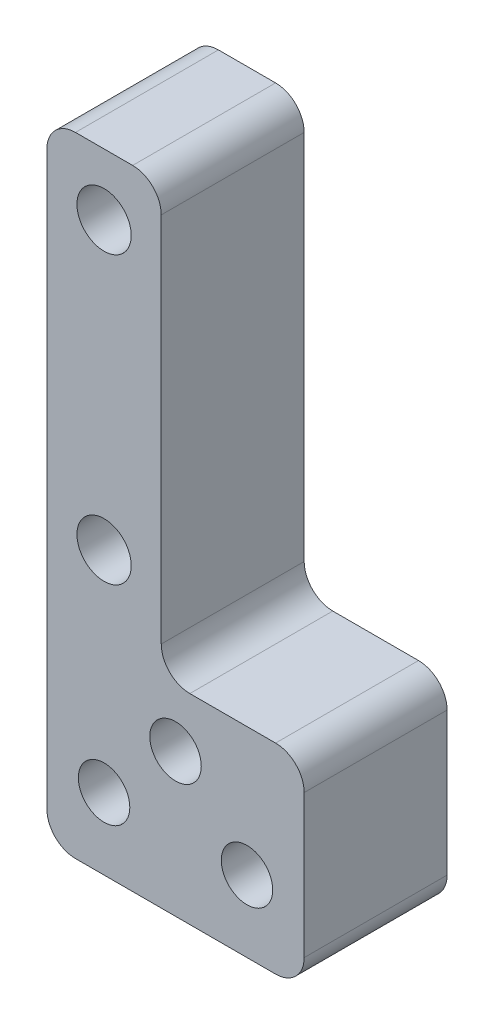
ISO-10303-21;
HEADER;
FILE_DESCRIPTION(('STEP AP214'),'2;1');
FILE_NAME('part.step','',(''),(''),'','','');
FILE_SCHEMA(('AUTOMOTIVE_DESIGN { 1 0 10303 214 1 1 1 1 }'));
ENDSEC;
DATA;
#1=APPLICATION_CONTEXT('core data for automotive mechanical design processes');
#2=APPLICATION_PROTOCOL_DEFINITION('international standard','automotive_design',2000,#1);
#3=PRODUCT_CONTEXT('',#1,'mechanical');
#4=PRODUCT('Part','Part','',(#3));
#5=PRODUCT_RELATED_PRODUCT_CATEGORY('part','',(#4));
#6=PRODUCT_DEFINITION_FORMATION('','',#4);
#7=PRODUCT_DEFINITION_CONTEXT('part definition',#1,'design');
#8=PRODUCT_DEFINITION('design','',#6,#7);
#9=PRODUCT_DEFINITION_SHAPE('','',#8);
#10=(LENGTH_UNIT() NAMED_UNIT(*) SI_UNIT(.MILLI.,.METRE.));
#11=(NAMED_UNIT(*) PLANE_ANGLE_UNIT() SI_UNIT($,.RADIAN.));
#12=(NAMED_UNIT(*) SI_UNIT($,.STERADIAN.) SOLID_ANGLE_UNIT());
#13=UNCERTAINTY_MEASURE_WITH_UNIT(LENGTH_MEASURE(1.E-05),#10,'distance_accuracy_value','');
#14=(GEOMETRIC_REPRESENTATION_CONTEXT(3) GLOBAL_UNCERTAINTY_ASSIGNED_CONTEXT((#13)) GLOBAL_UNIT_ASSIGNED_CONTEXT((#10,
#11,#12)) REPRESENTATION_CONTEXT('',''));
#15=CARTESIAN_POINT('',(0.,0.,0.));
#16=DIRECTION('',(0.,0.,1.));
#17=DIRECTION('',(1.,0.,0.));
#18=AXIS2_PLACEMENT_3D('',#15,#16,#17);
#19=CARTESIAN_POINT('',(17.78,0.,12.7));
#20=DIRECTION('',(1.,0.,0.));
#21=DIRECTION('',(0.,1.,0.));
#22=AXIS2_PLACEMENT_3D('',#19,#20,#21);
#23=PLANE('',#22);
#24=DIRECTION('',(0.,-1.,0.));
#25=VECTOR('',#24,1.);
#26=CARTESIAN_POINT('',(17.78,0.,12.7));
#27=LINE('',#26,#25);
#28=CARTESIAN_POINT('',(17.78,-35.179,12.7));
#29=VERTEX_POINT('',#28);
#30=CARTESIAN_POINT('',(17.78,-47.879,12.7));
#31=VERTEX_POINT('',#30);
#32=EDGE_CURVE('E287',#29,#31,#27,.T.);
#33=ORIENTED_EDGE('',*,*,#32,.T.);
#34=DIRECTION('',(0.,0.,-1.));
#35=VECTOR('',#34,1.);
#36=CARTESIAN_POINT('',(17.78,-47.879,0.));
#37=LINE('',#36,#35);
#38=CARTESIAN_POINT('',(17.78,-47.879,0.));
#39=VERTEX_POINT('',#38);
#40=EDGE_CURVE('E178',#31,#39,#37,.T.);
#41=ORIENTED_EDGE('',*,*,#40,.T.);
#42=DIRECTION('',(0.,-1.,0.));
#43=VECTOR('',#42,1.);
#44=CARTESIAN_POINT('',(17.78,0.,0.));
#45=LINE('',#44,#43);
#46=CARTESIAN_POINT('',(17.78,-35.179,0.));
#47=VERTEX_POINT('',#46);
#48=EDGE_CURVE('E161',#47,#39,#45,.T.);
#49=ORIENTED_EDGE('',*,*,#48,.F.);
#50=DIRECTION('',(0.,0.,-1.));
#51=VECTOR('',#50,1.);
#52=CARTESIAN_POINT('',(17.78,-35.179,12.7));
#53=LINE('',#52,#51);
#54=EDGE_CURVE('E175',#47,#29,#53,.F.);
#55=ORIENTED_EDGE('',*,*,#54,.T.);
#56=EDGE_LOOP('',(#33,#41,#49,#55));
#57=FACE_BOUND('',#56,.T.);
#58=ADVANCED_FACE('F45',(#57),#23,.T.);
#59=CARTESIAN_POINT('',(0.,-32.639,12.7));
#60=DIRECTION('',(0.,1.,0.));
#61=DIRECTION('',(0.,0.,1.));
#62=AXIS2_PLACEMENT_3D('',#59,#60,#61);
#63=PLANE('',#62);
#64=DIRECTION('',(1.,0.,0.));
#65=VECTOR('',#64,1.);
#66=CARTESIAN_POINT('',(0.,-32.639,12.7));
#67=LINE('',#66,#65);
#68=CARTESIAN_POINT('',(7.62,-32.639,12.7));
#69=VERTEX_POINT('',#68);
#70=CARTESIAN_POINT('',(15.24,-32.639,12.7));
#71=VERTEX_POINT('',#70);
#72=EDGE_CURVE('E275',#69,#71,#67,.T.);
#73=ORIENTED_EDGE('',*,*,#72,.T.);
#74=DIRECTION('',(0.,0.,-1.));
#75=VECTOR('',#74,1.);
#76=CARTESIAN_POINT('',(15.24,-32.639,12.7));
#77=LINE('',#76,#75);
#78=CARTESIAN_POINT('',(15.24,-32.639,0.));
#79=VERTEX_POINT('',#78);
#80=EDGE_CURVE('E231',#71,#79,#77,.T.);
#81=ORIENTED_EDGE('',*,*,#80,.T.);
#82=DIRECTION('',(1.,0.,0.));
#83=VECTOR('',#82,1.);
#84=CARTESIAN_POINT('',(0.,-32.639,0.));
#85=LINE('',#84,#83);
#86=CARTESIAN_POINT('',(7.62,-32.639,0.));
#87=VERTEX_POINT('',#86);
#88=EDGE_CURVE('E163',#87,#79,#85,.T.);
#89=ORIENTED_EDGE('',*,*,#88,.F.);
#90=DIRECTION('',(0.,0.,-1.));
#91=VECTOR('',#90,1.);
#92=CARTESIAN_POINT('',(7.62,-32.639,12.7));
#93=LINE('',#92,#91);
#94=EDGE_CURVE('E228',#87,#69,#93,.F.);
#95=ORIENTED_EDGE('',*,*,#94,.T.);
#96=EDGE_LOOP('',(#73,#81,#89,#95));
#97=FACE_BOUND('',#96,.T.);
#98=ADVANCED_FACE('F263',(#97),#63,.T.);
#99=CARTESIAN_POINT('',(5.08,0.,12.7));
#100=DIRECTION('',(-1.,0.,0.));
#101=DIRECTION('',(0.,0.,1.));
#102=AXIS2_PLACEMENT_3D('',#99,#100,#101);
#103=PLANE('',#102);
#104=DIRECTION('',(0.,1.,0.));
#105=VECTOR('',#104,1.);
#106=CARTESIAN_POINT('',(5.08,0.,0.));
#107=LINE('',#106,#105);
#108=CARTESIAN_POINT('',(5.08,-30.099,0.));
#109=VERTEX_POINT('',#108);
#110=CARTESIAN_POINT('',(5.08,2.921,0.));
#111=VERTEX_POINT('',#110);
#112=EDGE_CURVE('E257',#109,#111,#107,.T.);
#113=ORIENTED_EDGE('',*,*,#112,.T.);
#114=DIRECTION('',(0.,0.,-1.));
#115=VECTOR('',#114,1.);
#116=CARTESIAN_POINT('',(5.08,2.921,12.7));
#117=LINE('',#116,#115);
#118=CARTESIAN_POINT('',(5.08,2.921,12.7));
#119=VERTEX_POINT('',#118);
#120=EDGE_CURVE('E251',#111,#119,#117,.F.);
#121=ORIENTED_EDGE('',*,*,#120,.T.);
#122=DIRECTION('',(0.,1.,0.));
#123=VECTOR('',#122,1.);
#124=CARTESIAN_POINT('',(5.08,0.,12.7));
#125=LINE('',#124,#123);
#126=CARTESIAN_POINT('',(5.08,-30.099,12.7));
#127=VERTEX_POINT('',#126);
#128=EDGE_CURVE('E273',#127,#119,#125,.T.);
#129=ORIENTED_EDGE('',*,*,#128,.F.);
#130=DIRECTION('',(0.,0.,-1.));
#131=VECTOR('',#130,1.);
#132=CARTESIAN_POINT('',(5.08,-30.099,12.7));
#133=LINE('',#132,#131);
#134=EDGE_CURVE('E247',#127,#109,#133,.T.);
#135=ORIENTED_EDGE('',*,*,#134,.T.);
#136=EDGE_LOOP('',(#113,#121,#129,#135));
#137=FACE_BOUND('',#136,.T.);
#138=ADVANCED_FACE('F277',(#137),#103,.F.);
#139=CARTESIAN_POINT('',(0.,5.461,12.7));
#140=DIRECTION('',(0.,1.,0.));
#141=DIRECTION('',(0.,0.,1.));
#142=AXIS2_PLACEMENT_3D('',#139,#140,#141);
#143=PLANE('',#142);
#144=DIRECTION('',(1.,0.,0.));
#145=VECTOR('',#144,1.);
#146=CARTESIAN_POINT('',(0.,5.461,0.));
#147=LINE('',#146,#145);
#148=CARTESIAN_POINT('',(-2.54,5.461,0.));
#149=VERTEX_POINT('',#148);
#150=CARTESIAN_POINT('',(2.54,5.461,0.));
#151=VERTEX_POINT('',#150);
#152=EDGE_CURVE('E311',#149,#151,#147,.T.);
#153=ORIENTED_EDGE('',*,*,#152,.F.);
#154=DIRECTION('',(0.,0.,-1.));
#155=VECTOR('',#154,1.);
#156=CARTESIAN_POINT('',(-2.54,5.461,12.7));
#157=LINE('',#156,#155);
#158=CARTESIAN_POINT('',(-2.54,5.461,12.7));
#159=VERTEX_POINT('',#158);
#160=EDGE_CURVE('E244',#149,#159,#157,.F.);
#161=ORIENTED_EDGE('',*,*,#160,.T.);
#162=DIRECTION('',(1.,0.,0.));
#163=VECTOR('',#162,1.);
#164=CARTESIAN_POINT('',(0.,5.461,12.7));
#165=LINE('',#164,#163);
#166=CARTESIAN_POINT('',(2.54,5.461,12.7));
#167=VERTEX_POINT('',#166);
#168=EDGE_CURVE('E280',#159,#167,#165,.T.);
#169=ORIENTED_EDGE('',*,*,#168,.T.);
#170=DIRECTION('',(0.,0.,-1.));
#171=VECTOR('',#170,1.);
#172=CARTESIAN_POINT('',(2.54,5.461,0.));
#173=LINE('',#172,#171);
#174=EDGE_CURVE('E240',#167,#151,#173,.T.);
#175=ORIENTED_EDGE('',*,*,#174,.T.);
#176=EDGE_LOOP('',(#153,#161,#169,#175));
#177=FACE_BOUND('',#176,.T.);
#178=ADVANCED_FACE('F362',(#177),#143,.T.);
#179=CARTESIAN_POINT('',(-5.08,0.,12.7));
#180=DIRECTION('',(1.,0.,0.));
#181=DIRECTION('',(0.,1.,0.));
#182=AXIS2_PLACEMENT_3D('',#179,#180,#181);
#183=PLANE('',#182);
#184=DIRECTION('',(0.,-1.,0.));
#185=VECTOR('',#184,1.);
#186=CARTESIAN_POINT('',(-5.08,0.,0.));
#187=LINE('',#186,#185);
#188=CARTESIAN_POINT('',(-5.08,2.921,0.));
#189=VERTEX_POINT('',#188);
#190=CARTESIAN_POINT('',(-5.08,-47.879,0.));
#191=VERTEX_POINT('',#190);
#192=EDGE_CURVE('E315',#189,#191,#187,.T.);
#193=ORIENTED_EDGE('',*,*,#192,.T.);
#194=DIRECTION('',(0.,0.,-1.));
#195=VECTOR('',#194,1.);
#196=CARTESIAN_POINT('',(-5.08,-47.879,12.7));
#197=LINE('',#196,#195);
#198=CARTESIAN_POINT('',(-5.08,-47.879,12.7));
#199=VERTEX_POINT('',#198);
#200=EDGE_CURVE('E61',#191,#199,#197,.F.);
#201=ORIENTED_EDGE('',*,*,#200,.T.);
#202=DIRECTION('',(0.,-1.,0.));
#203=VECTOR('',#202,1.);
#204=CARTESIAN_POINT('',(-5.08,0.,12.7));
#205=LINE('',#204,#203);
#206=CARTESIAN_POINT('',(-5.08,2.921,12.7));
#207=VERTEX_POINT('',#206);
#208=EDGE_CURVE('E284',#207,#199,#205,.T.);
#209=ORIENTED_EDGE('',*,*,#208,.F.);
#210=DIRECTION('',(0.,0.,-1.));
#211=VECTOR('',#210,1.);
#212=CARTESIAN_POINT('',(-5.08,2.921,0.));
#213=LINE('',#212,#211);
#214=EDGE_CURVE('E234',#207,#189,#213,.T.);
#215=ORIENTED_EDGE('',*,*,#214,.T.);
#216=EDGE_LOOP('',(#193,#201,#209,#215));
#217=FACE_BOUND('',#216,.T.);
#218=ADVANCED_FACE('F355',(#217),#183,.F.);
#219=CARTESIAN_POINT('',(0.,-25.4,12.7));
#220=DIRECTION('',(0.,0.,-1.));
#221=DIRECTION('',(-1.,0.,0.));
#222=AXIS2_PLACEMENT_3D('',#219,#220,#221);
#223=CYLINDRICAL_SURFACE('',#222,2.413);
#224=CARTESIAN_POINT('',(0.,-25.4,12.7));
#225=DIRECTION('',(0.,0.,1.));
#226=DIRECTION('',(1.,0.,0.));
#227=AXIS2_PLACEMENT_3D('',#224,#225,#226);
#228=CIRCLE('',#227,2.413);
#229=CARTESIAN_POINT('',(2.413,-25.4,12.7));
#230=VERTEX_POINT('',#229);
#231=EDGE_CURVE('E194',#230,#230,#228,.T.);
#232=ORIENTED_EDGE('',*,*,#231,.T.);
#233=EDGE_LOOP('',(#232));
#234=FACE_BOUND('',#233,.T.);
#235=CARTESIAN_POINT('',(0.,-25.4,0.));
#236=DIRECTION('',(0.,0.,1.));
#237=DIRECTION('',(1.,0.,0.));
#238=AXIS2_PLACEMENT_3D('',#235,#236,#237);
#239=CIRCLE('',#238,2.413);
#240=CARTESIAN_POINT('',(2.413,-25.4,0.));
#241=VERTEX_POINT('',#240);
#242=EDGE_CURVE('E321',#241,#241,#239,.T.);
#243=ORIENTED_EDGE('',*,*,#242,.F.);
#244=EDGE_LOOP('',(#243));
#245=FACE_BOUND('',#244,.T.);
#246=ADVANCED_FACE('F458',(#234,#245),#223,.F.);
#247=CARTESIAN_POINT('',(0.,-50.419,12.7));
#248=DIRECTION('',(0.,1.,0.));
#249=DIRECTION('',(0.,0.,1.));
#250=AXIS2_PLACEMENT_3D('',#247,#248,#249);
#251=PLANE('',#250);
#252=DIRECTION('',(1.,0.,0.));
#253=VECTOR('',#252,1.);
#254=CARTESIAN_POINT('',(0.,-50.419,0.));
#255=LINE('',#254,#253);
#256=CARTESIAN_POINT('',(-2.54,-50.419,0.));
#257=VERTEX_POINT('',#256);
#258=CARTESIAN_POINT('',(15.24,-50.419,0.));
#259=VERTEX_POINT('',#258);
#260=EDGE_CURVE('E318',#257,#259,#255,.T.);
#261=ORIENTED_EDGE('',*,*,#260,.T.);
#262=DIRECTION('',(0.,0.,-1.));
#263=VECTOR('',#262,1.);
#264=CARTESIAN_POINT('',(15.24,-50.419,12.7));
#265=LINE('',#264,#263);
#266=CARTESIAN_POINT('',(15.24,-50.419,12.7));
#267=VERTEX_POINT('',#266);
#268=EDGE_CURVE('E213',#259,#267,#265,.F.);
#269=ORIENTED_EDGE('',*,*,#268,.T.);
#270=DIRECTION('',(1.,0.,0.));
#271=VECTOR('',#270,1.);
#272=CARTESIAN_POINT('',(0.,-50.419,12.7));
#273=LINE('',#272,#271);
#274=CARTESIAN_POINT('',(-2.54,-50.419,12.7));
#275=VERTEX_POINT('',#274);
#276=EDGE_CURVE('E293',#275,#267,#273,.T.);
#277=ORIENTED_EDGE('',*,*,#276,.F.);
#278=DIRECTION('',(0.,0.,-1.));
#279=VECTOR('',#278,1.);
#280=CARTESIAN_POINT('',(-2.54,-50.419,12.7));
#281=LINE('',#280,#279);
#282=EDGE_CURVE('E209',#275,#257,#281,.T.);
#283=ORIENTED_EDGE('',*,*,#282,.T.);
#284=EDGE_LOOP('',(#261,#269,#277,#283));
#285=FACE_BOUND('',#284,.T.);
#286=ADVANCED_FACE('F348',(#285),#251,.F.);
#287=CARTESIAN_POINT('',(0.,-44.069,12.7));
#288=DIRECTION('',(0.,0.,-1.));
#289=DIRECTION('',(-1.,0.,0.));
#290=AXIS2_PLACEMENT_3D('',#287,#288,#289);
#291=CYLINDRICAL_SURFACE('',#290,2.286);
#292=CARTESIAN_POINT('',(0.,-44.069,12.7));
#293=DIRECTION('',(0.,0.,1.));
#294=DIRECTION('',(1.,0.,0.));
#295=AXIS2_PLACEMENT_3D('',#292,#293,#294);
#296=CIRCLE('',#295,2.286);
#297=CARTESIAN_POINT('',(2.286,-44.069,12.7));
#298=VERTEX_POINT('',#297);
#299=EDGE_CURVE('E337',#298,#298,#296,.T.);
#300=ORIENTED_EDGE('',*,*,#299,.T.);
#301=EDGE_LOOP('',(#300));
#302=FACE_BOUND('',#301,.T.);
#303=CARTESIAN_POINT('',(0.,-44.069,0.));
#304=DIRECTION('',(0.,0.,1.));
#305=DIRECTION('',(1.,0.,0.));
#306=AXIS2_PLACEMENT_3D('',#303,#304,#305);
#307=CIRCLE('',#306,2.286);
#308=CARTESIAN_POINT('',(2.286,-44.069,0.));
#309=VERTEX_POINT('',#308);
#310=EDGE_CURVE('E180',#309,#309,#307,.T.);
#311=ORIENTED_EDGE('',*,*,#310,.F.);
#312=EDGE_LOOP('',(#311));
#313=FACE_BOUND('',#312,.T.);
#314=ADVANCED_FACE('F380',(#302,#313),#291,.F.);
#315=CARTESIAN_POINT('',(12.7,-44.069,12.7));
#316=DIRECTION('',(0.,0.,-1.));
#317=DIRECTION('',(-1.,0.,0.));
#318=AXIS2_PLACEMENT_3D('',#315,#316,#317);
#319=CYLINDRICAL_SURFACE('',#318,2.28599999999999);
#320=CARTESIAN_POINT('',(12.7,-44.069,12.7));
#321=DIRECTION('',(0.,0.,1.));
#322=DIRECTION('',(1.,0.,0.));
#323=AXIS2_PLACEMENT_3D('',#320,#321,#322);
#324=CIRCLE('',#323,2.28599999999999);
#325=CARTESIAN_POINT('',(14.986,-44.069,12.7));
#326=VERTEX_POINT('',#325);
#327=EDGE_CURVE('E331',#326,#326,#324,.T.);
#328=ORIENTED_EDGE('',*,*,#327,.T.);
#329=EDGE_LOOP('',(#328));
#330=FACE_BOUND('',#329,.T.);
#331=CARTESIAN_POINT('',(12.7,-44.069,0.));
#332=DIRECTION('',(0.,0.,1.));
#333=DIRECTION('',(1.,0.,0.));
#334=AXIS2_PLACEMENT_3D('',#331,#332,#333);
#335=CIRCLE('',#334,2.28599999999999);
#336=CARTESIAN_POINT('',(14.986,-44.069,0.));
#337=VERTEX_POINT('',#336);
#338=EDGE_CURVE('E303',#337,#337,#335,.T.);
#339=ORIENTED_EDGE('',*,*,#338,.F.);
#340=EDGE_LOOP('',(#339));
#341=FACE_BOUND('',#340,.T.);
#342=ADVANCED_FACE('F383',(#330,#341),#319,.F.);
#343=CARTESIAN_POINT('',(6.35,-37.719,12.7));
#344=DIRECTION('',(0.,0.,-1.));
#345=DIRECTION('',(-1.,0.,0.));
#346=AXIS2_PLACEMENT_3D('',#343,#344,#345);
#347=CYLINDRICAL_SURFACE('',#346,2.286);
#348=CARTESIAN_POINT('',(6.35,-37.719,12.7));
#349=DIRECTION('',(0.,0.,1.));
#350=DIRECTION('',(1.,0.,0.));
#351=AXIS2_PLACEMENT_3D('',#348,#349,#350);
#352=CIRCLE('',#351,2.286);
#353=CARTESIAN_POINT('',(8.636,-37.719,12.7));
#354=VERTEX_POINT('',#353);
#355=EDGE_CURVE('E326',#354,#354,#352,.T.);
#356=ORIENTED_EDGE('',*,*,#355,.T.);
#357=EDGE_LOOP('',(#356));
#358=FACE_BOUND('',#357,.T.);
#359=CARTESIAN_POINT('',(6.35,-37.719,0.));
#360=DIRECTION('',(0.,0.,1.));
#361=DIRECTION('',(1.,0.,0.));
#362=AXIS2_PLACEMENT_3D('',#359,#360,#361);
#363=CIRCLE('',#362,2.286);
#364=CARTESIAN_POINT('',(8.636,-37.719,0.));
#365=VERTEX_POINT('',#364);
#366=EDGE_CURVE('E299',#365,#365,#363,.T.);
#367=ORIENTED_EDGE('',*,*,#366,.F.);
#368=EDGE_LOOP('',(#367));
#369=FACE_BOUND('',#368,.T.);
#370=ADVANCED_FACE('F387',(#358,#369),#347,.F.);
#371=CARTESIAN_POINT('',(0.,0.,12.7));
#372=DIRECTION('',(0.,0.,-1.));
#373=DIRECTION('',(-1.,0.,0.));
#374=AXIS2_PLACEMENT_3D('',#371,#372,#373);
#375=CYLINDRICAL_SURFACE('',#374,2.413);
#376=CARTESIAN_POINT('',(0.,0.,12.7));
#377=DIRECTION('',(0.,0.,1.));
#378=DIRECTION('',(1.,0.,0.));
#379=AXIS2_PLACEMENT_3D('',#376,#377,#378);
#380=CIRCLE('',#379,2.413);
#381=CARTESIAN_POINT('',(2.413,0.,12.7));
#382=VERTEX_POINT('',#381);
#383=EDGE_CURVE('E186',#382,#382,#380,.T.);
#384=ORIENTED_EDGE('',*,*,#383,.T.);
#385=EDGE_LOOP('',(#384));
#386=FACE_BOUND('',#385,.T.);
#387=CARTESIAN_POINT('',(0.,0.,0.));
#388=DIRECTION('',(0.,0.,1.));
#389=DIRECTION('',(1.,0.,0.));
#390=AXIS2_PLACEMENT_3D('',#387,#388,#389);
#391=CIRCLE('',#390,2.413);
#392=CARTESIAN_POINT('',(2.413,0.,0.));
#393=VERTEX_POINT('',#392);
#394=EDGE_CURVE('E197',#393,#393,#391,.T.);
#395=ORIENTED_EDGE('',*,*,#394,.F.);
#396=EDGE_LOOP('',(#395));
#397=FACE_BOUND('',#396,.T.);
#398=ADVANCED_FACE('F391',(#386,#397),#375,.F.);
#399=CARTESIAN_POINT('',(0.,0.,12.7));
#400=DIRECTION('',(0.,0.,1.));
#401=DIRECTION('',(1.,0.,0.));
#402=AXIS2_PLACEMENT_3D('',#399,#400,#401);
#403=PLANE('',#402);
#404=ORIENTED_EDGE('',*,*,#355,.F.);
#405=EDGE_LOOP('',(#404));
#406=FACE_BOUND('',#405,.T.);
#407=ORIENTED_EDGE('',*,*,#327,.F.);
#408=EDGE_LOOP('',(#407));
#409=FACE_BOUND('',#408,.T.);
#410=ORIENTED_EDGE('',*,*,#299,.F.);
#411=EDGE_LOOP('',(#410));
#412=FACE_BOUND('',#411,.T.);
#413=ORIENTED_EDGE('',*,*,#276,.T.);
#414=CARTESIAN_POINT('',(15.24,-47.879,12.7));
#415=DIRECTION('',(0.,0.,1.));
#416=DIRECTION('',(1.,0.,0.));
#417=AXIS2_PLACEMENT_3D('',#414,#415,#416);
#418=CIRCLE('',#417,2.54);
#419=EDGE_CURVE('E225',#267,#31,#418,.T.);
#420=ORIENTED_EDGE('',*,*,#419,.T.);
#421=ORIENTED_EDGE('',*,*,#32,.F.);
#422=CARTESIAN_POINT('',(15.24,-35.179,12.7));
#423=DIRECTION('',(0.,0.,1.));
#424=DIRECTION('',(1.,0.,0.));
#425=AXIS2_PLACEMENT_3D('',#422,#423,#424);
#426=CIRCLE('',#425,2.54);
#427=EDGE_CURVE('E184',#29,#71,#426,.T.);
#428=ORIENTED_EDGE('',*,*,#427,.T.);
#429=ORIENTED_EDGE('',*,*,#72,.F.);
#430=CARTESIAN_POINT('',(7.62,-30.099,12.7));
#431=DIRECTION('',(0.,0.,1.));
#432=DIRECTION('',(1.,0.,0.));
#433=AXIS2_PLACEMENT_3D('',#430,#431,#432);
#434=CIRCLE('',#433,2.54);
#435=EDGE_CURVE('E11',#69,#127,#434,.F.);
#436=ORIENTED_EDGE('',*,*,#435,.T.);
#437=ORIENTED_EDGE('',*,*,#128,.T.);
#438=CARTESIAN_POINT('',(2.54,2.921,12.7));
#439=DIRECTION('',(0.,0.,1.));
#440=DIRECTION('',(1.,0.,0.));
#441=AXIS2_PLACEMENT_3D('',#438,#439,#440);
#442=CIRCLE('',#441,2.54);
#443=EDGE_CURVE('E216',#119,#167,#442,.T.);
#444=ORIENTED_EDGE('',*,*,#443,.T.);
#445=ORIENTED_EDGE('',*,*,#168,.F.);
#446=CARTESIAN_POINT('',(-2.54,2.921,12.7));
#447=DIRECTION('',(0.,0.,1.));
#448=DIRECTION('',(1.,0.,0.));
#449=AXIS2_PLACEMENT_3D('',#446,#447,#448);
#450=CIRCLE('',#449,2.54);
#451=EDGE_CURVE('E68',#159,#207,#450,.T.);
#452=ORIENTED_EDGE('',*,*,#451,.T.);
#453=ORIENTED_EDGE('',*,*,#208,.T.);
#454=CARTESIAN_POINT('',(-2.54,-47.879,12.7));
#455=DIRECTION('',(0.,0.,1.));
#456=DIRECTION('',(1.,0.,0.));
#457=AXIS2_PLACEMENT_3D('',#454,#455,#456);
#458=CIRCLE('',#457,2.54);
#459=EDGE_CURVE('E221',#199,#275,#458,.T.);
#460=ORIENTED_EDGE('',*,*,#459,.T.);
#461=EDGE_LOOP('',(#413,#420,#421,#428,#429,#436,#437,#444,#445,#452,#453,#460));
#462=FACE_BOUND('',#461,.T.);
#463=ORIENTED_EDGE('',*,*,#231,.F.);
#464=EDGE_LOOP('',(#463));
#465=FACE_BOUND('',#464,.T.);
#466=ORIENTED_EDGE('',*,*,#383,.F.);
#467=EDGE_LOOP('',(#466));
#468=FACE_BOUND('',#467,.T.);
#469=ADVANCED_FACE('F271',(#406,#409,#412,#462,#465,#468),#403,.T.);
#470=CARTESIAN_POINT('',(0.,0.,0.));
#471=DIRECTION('',(0.,0.,1.));
#472=DIRECTION('',(1.,0.,0.));
#473=AXIS2_PLACEMENT_3D('',#470,#471,#472);
#474=PLANE('',#473);
#475=ORIENTED_EDGE('',*,*,#366,.T.);
#476=EDGE_LOOP('',(#475));
#477=FACE_BOUND('',#476,.T.);
#478=ORIENTED_EDGE('',*,*,#338,.T.);
#479=EDGE_LOOP('',(#478));
#480=FACE_BOUND('',#479,.T.);
#481=ORIENTED_EDGE('',*,*,#310,.T.);
#482=EDGE_LOOP('',(#481));
#483=FACE_BOUND('',#482,.T.);
#484=ORIENTED_EDGE('',*,*,#48,.T.);
#485=CARTESIAN_POINT('',(15.24,-47.879,0.));
#486=DIRECTION('',(0.,0.,1.));
#487=DIRECTION('',(1.,0.,0.));
#488=AXIS2_PLACEMENT_3D('',#485,#486,#487);
#489=CIRCLE('',#488,2.54);
#490=EDGE_CURVE('E169',#39,#259,#489,.F.);
#491=ORIENTED_EDGE('',*,*,#490,.T.);
#492=ORIENTED_EDGE('',*,*,#260,.F.);
#493=CARTESIAN_POINT('',(-2.54,-47.879,0.));
#494=DIRECTION('',(0.,0.,1.));
#495=DIRECTION('',(1.,0.,0.));
#496=AXIS2_PLACEMENT_3D('',#493,#494,#495);
#497=CIRCLE('',#496,2.54);
#498=EDGE_CURVE('E170',#257,#191,#497,.F.);
#499=ORIENTED_EDGE('',*,*,#498,.T.);
#500=ORIENTED_EDGE('',*,*,#192,.F.);
#501=CARTESIAN_POINT('',(-2.54,2.921,0.));
#502=DIRECTION('',(0.,0.,1.));
#503=DIRECTION('',(1.,0.,0.));
#504=AXIS2_PLACEMENT_3D('',#501,#502,#503);
#505=CIRCLE('',#504,2.54);
#506=EDGE_CURVE('E202',#189,#149,#505,.F.);
#507=ORIENTED_EDGE('',*,*,#506,.T.);
#508=ORIENTED_EDGE('',*,*,#152,.T.);
#509=CARTESIAN_POINT('',(2.54,2.921,0.));
#510=DIRECTION('',(0.,0.,1.));
#511=DIRECTION('',(1.,0.,0.));
#512=AXIS2_PLACEMENT_3D('',#509,#510,#511);
#513=CIRCLE('',#512,2.54);
#514=EDGE_CURVE('E190',#151,#111,#513,.F.);
#515=ORIENTED_EDGE('',*,*,#514,.T.);
#516=ORIENTED_EDGE('',*,*,#112,.F.);
#517=CARTESIAN_POINT('',(7.62,-30.099,0.));
#518=DIRECTION('',(0.,0.,1.));
#519=DIRECTION('',(1.,0.,0.));
#520=AXIS2_PLACEMENT_3D('',#517,#518,#519);
#521=CIRCLE('',#520,2.54);
#522=EDGE_CURVE('E54',#109,#87,#521,.T.);
#523=ORIENTED_EDGE('',*,*,#522,.T.);
#524=ORIENTED_EDGE('',*,*,#88,.T.);
#525=CARTESIAN_POINT('',(15.24,-35.179,0.));
#526=DIRECTION('',(0.,0.,1.));
#527=DIRECTION('',(1.,0.,0.));
#528=AXIS2_PLACEMENT_3D('',#525,#526,#527);
#529=CIRCLE('',#528,2.54);
#530=EDGE_CURVE('E157',#79,#47,#529,.F.);
#531=ORIENTED_EDGE('',*,*,#530,.T.);
#532=EDGE_LOOP('',(#484,#491,#492,#499,#500,#507,#508,#515,#516,#523,#524,#531));
#533=FACE_BOUND('',#532,.T.);
#534=ORIENTED_EDGE('',*,*,#242,.T.);
#535=EDGE_LOOP('',(#534));
#536=FACE_BOUND('',#535,.T.);
#537=ORIENTED_EDGE('',*,*,#394,.T.);
#538=EDGE_LOOP('',(#537));
#539=FACE_BOUND('',#538,.T.);
#540=ADVANCED_FACE('F159',(#477,#480,#483,#533,#536,#539),#474,.F.);
#541=CARTESIAN_POINT('',(15.24,-47.879,12.7));
#542=DIRECTION('',(0.,0.,1.));
#543=DIRECTION('',(1.,0.,0.));
#544=AXIS2_PLACEMENT_3D('',#541,#542,#543);
#545=CYLINDRICAL_SURFACE('',#544,2.54);
#546=ORIENTED_EDGE('',*,*,#419,.F.);
#547=ORIENTED_EDGE('',*,*,#268,.F.);
#548=ORIENTED_EDGE('',*,*,#490,.F.);
#549=ORIENTED_EDGE('',*,*,#40,.F.);
#550=EDGE_LOOP('',(#546,#547,#548,#549));
#551=FACE_BOUND('',#550,.T.);
#552=ADVANCED_FACE('F344',(#551),#545,.T.);
#553=CARTESIAN_POINT('',(15.24,-35.179,12.7));
#554=DIRECTION('',(0.,0.,-1.));
#555=DIRECTION('',(-1.,0.,0.));
#556=AXIS2_PLACEMENT_3D('',#553,#554,#555);
#557=CYLINDRICAL_SURFACE('',#556,2.54);
#558=ORIENTED_EDGE('',*,*,#427,.F.);
#559=ORIENTED_EDGE('',*,*,#54,.F.);
#560=ORIENTED_EDGE('',*,*,#530,.F.);
#561=ORIENTED_EDGE('',*,*,#80,.F.);
#562=EDGE_LOOP('',(#558,#559,#560,#561));
#563=FACE_BOUND('',#562,.T.);
#564=ADVANCED_FACE('F183',(#563),#557,.T.);
#565=CARTESIAN_POINT('',(-2.54,-47.879,12.7));
#566=DIRECTION('',(0.,0.,-1.));
#567=DIRECTION('',(-1.,0.,0.));
#568=AXIS2_PLACEMENT_3D('',#565,#566,#567);
#569=CYLINDRICAL_SURFACE('',#568,2.54);
#570=ORIENTED_EDGE('',*,*,#459,.F.);
#571=ORIENTED_EDGE('',*,*,#200,.F.);
#572=ORIENTED_EDGE('',*,*,#498,.F.);
#573=ORIENTED_EDGE('',*,*,#282,.F.);
#574=EDGE_LOOP('',(#570,#571,#572,#573));
#575=FACE_BOUND('',#574,.T.);
#576=ADVANCED_FACE('F353',(#575),#569,.T.);
#577=CARTESIAN_POINT('',(-2.54,2.921,12.7));
#578=DIRECTION('',(0.,0.,1.));
#579=DIRECTION('',(1.,0.,0.));
#580=AXIS2_PLACEMENT_3D('',#577,#578,#579);
#581=CYLINDRICAL_SURFACE('',#580,2.54);
#582=ORIENTED_EDGE('',*,*,#451,.F.);
#583=ORIENTED_EDGE('',*,*,#160,.F.);
#584=ORIENTED_EDGE('',*,*,#506,.F.);
#585=ORIENTED_EDGE('',*,*,#214,.F.);
#586=EDGE_LOOP('',(#582,#583,#584,#585));
#587=FACE_BOUND('',#586,.T.);
#588=ADVANCED_FACE('F358',(#587),#581,.T.);
#589=CARTESIAN_POINT('',(2.54,2.921,12.7));
#590=DIRECTION('',(0.,0.,1.));
#591=DIRECTION('',(1.,0.,0.));
#592=AXIS2_PLACEMENT_3D('',#589,#590,#591);
#593=CYLINDRICAL_SURFACE('',#592,2.54);
#594=ORIENTED_EDGE('',*,*,#443,.F.);
#595=ORIENTED_EDGE('',*,*,#120,.F.);
#596=ORIENTED_EDGE('',*,*,#514,.F.);
#597=ORIENTED_EDGE('',*,*,#174,.F.);
#598=EDGE_LOOP('',(#594,#595,#596,#597));
#599=FACE_BOUND('',#598,.T.);
#600=ADVANCED_FACE('F365',(#599),#593,.T.);
#601=CARTESIAN_POINT('',(7.62,-30.099,12.7));
#602=DIRECTION('',(0.,0.,-1.));
#603=DIRECTION('',(-1.,0.,0.));
#604=AXIS2_PLACEMENT_3D('',#601,#602,#603);
#605=CYLINDRICAL_SURFACE('',#604,2.54);
#606=ORIENTED_EDGE('',*,*,#435,.F.);
#607=ORIENTED_EDGE('',*,*,#94,.F.);
#608=ORIENTED_EDGE('',*,*,#522,.F.);
#609=ORIENTED_EDGE('',*,*,#134,.F.);
#610=EDGE_LOOP('',(#606,#607,#608,#609));
#611=FACE_BOUND('',#610,.T.);
#612=ADVANCED_FACE('F47',(#611),#605,.F.);
#613=CLOSED_SHELL('',(#58,#98,#138,#178,#218,#246,#286,#314,#342,#370,#398,#469,#540,#552,#564,
#576,#588,#600,#612));
#614=MANIFOLD_SOLID_BREP('B2',#613);
#615=ADVANCED_BREP_SHAPE_REPRESENTATION('',(#18,#614),#14);
#616=SHAPE_DEFINITION_REPRESENTATION(#9,#615);
ENDSEC;
END-ISO-10303-21;
